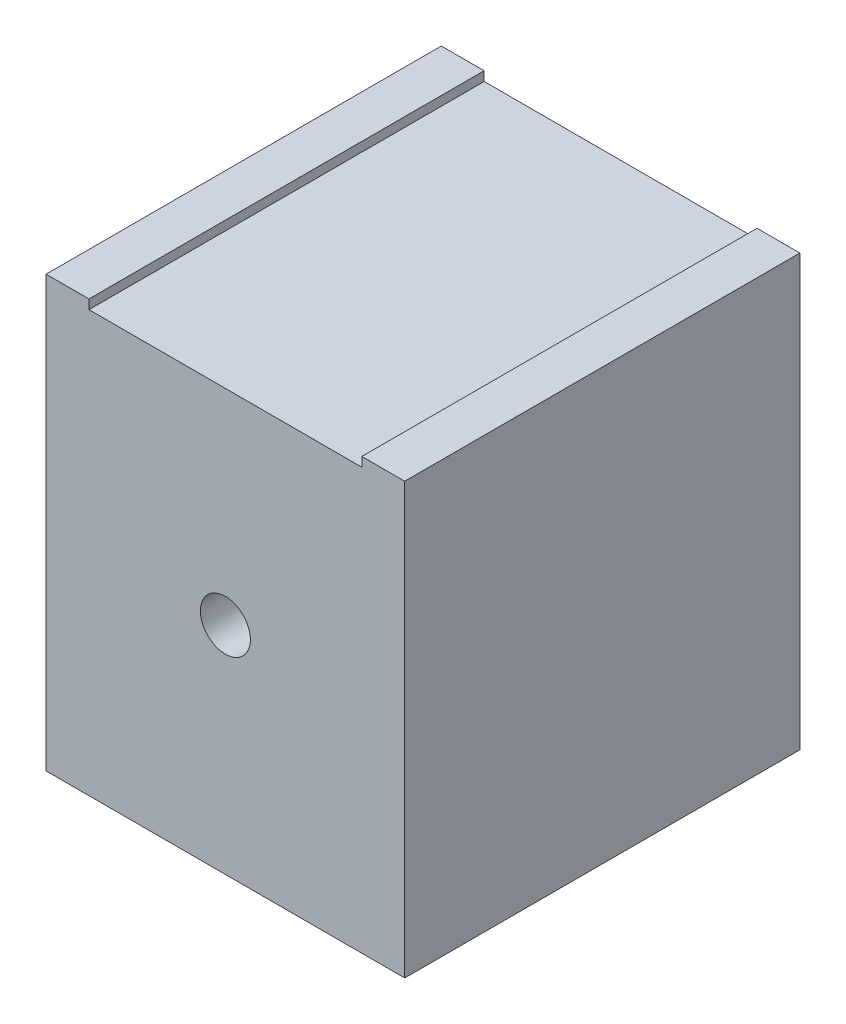
ISO-10303-21;
HEADER;
FILE_DESCRIPTION(('STEP AP214'),'2;1');
FILE_NAME('part.step','',(''),(''),'','','');
FILE_SCHEMA(('AUTOMOTIVE_DESIGN { 1 0 10303 214 1 1 1 1 }'));
ENDSEC;
DATA;
#1=APPLICATION_CONTEXT('core data for automotive mechanical design processes');
#2=APPLICATION_PROTOCOL_DEFINITION('international standard','automotive_design',2000,#1);
#3=PRODUCT_CONTEXT('',#1,'mechanical');
#4=PRODUCT('Part','Part','',(#3));
#5=PRODUCT_RELATED_PRODUCT_CATEGORY('part','',(#4));
#6=PRODUCT_DEFINITION_FORMATION('','',#4);
#7=PRODUCT_DEFINITION_CONTEXT('part definition',#1,'design');
#8=PRODUCT_DEFINITION('design','',#6,#7);
#9=PRODUCT_DEFINITION_SHAPE('','',#8);
#10=(LENGTH_UNIT() NAMED_UNIT(*) SI_UNIT(.MILLI.,.METRE.));
#11=(NAMED_UNIT(*) PLANE_ANGLE_UNIT() SI_UNIT($,.RADIAN.));
#12=(NAMED_UNIT(*) SI_UNIT($,.STERADIAN.) SOLID_ANGLE_UNIT());
#13=UNCERTAINTY_MEASURE_WITH_UNIT(LENGTH_MEASURE(1.E-05),#10,'distance_accuracy_value','');
#14=(GEOMETRIC_REPRESENTATION_CONTEXT(3) GLOBAL_UNCERTAINTY_ASSIGNED_CONTEXT((#13)) GLOBAL_UNIT_ASSIGNED_CONTEXT((#10,
#11,#12)) REPRESENTATION_CONTEXT('',''));
#15=CARTESIAN_POINT('',(0.,0.,0.));
#16=DIRECTION('',(0.,0.,1.));
#17=DIRECTION('',(1.,0.,0.));
#18=AXIS2_PLACEMENT_3D('',#15,#16,#17);
#19=CARTESIAN_POINT('',(0.,60.2,55.3));
#20=DIRECTION('',(0.,-1.,0.));
#21=DIRECTION('',(0.,0.,-1.));
#22=AXIS2_PLACEMENT_3D('',#19,#20,#21);
#23=PLANE('',#22);
#24=DIRECTION('',(-1.,0.,0.));
#25=VECTOR('',#24,1.);
#26=CARTESIAN_POINT('',(0.,60.2,55.3));
#27=LINE('',#26,#25);
#28=CARTESIAN_POINT('',(6.00000000000001,60.2,55.3));
#29=VERTEX_POINT('',#28);
#30=CARTESIAN_POINT('',(0.,60.2,55.3));
#31=VERTEX_POINT('',#30);
#32=EDGE_CURVE('E66',#29,#31,#27,.T.);
#33=ORIENTED_EDGE('',*,*,#32,.F.);
#34=DIRECTION('',(0.,0.,1.));
#35=VECTOR('',#34,1.);
#36=CARTESIAN_POINT('',(6.,60.2,0.));
#37=LINE('',#36,#35);
#38=CARTESIAN_POINT('',(6.,60.2,0.));
#39=VERTEX_POINT('',#38);
#40=EDGE_CURVE('E130',#39,#29,#37,.T.);
#41=ORIENTED_EDGE('',*,*,#40,.F.);
#42=DIRECTION('',(-1.,0.,0.));
#43=VECTOR('',#42,1.);
#44=CARTESIAN_POINT('',(0.,60.2,0.));
#45=LINE('',#44,#43);
#46=CARTESIAN_POINT('',(0.,60.2,0.));
#47=VERTEX_POINT('',#46);
#48=EDGE_CURVE('E88',#39,#47,#45,.T.);
#49=ORIENTED_EDGE('',*,*,#48,.T.);
#50=DIRECTION('',(0.,0.,-1.));
#51=VECTOR('',#50,1.);
#52=CARTESIAN_POINT('',(0.,60.2,55.3));
#53=LINE('',#52,#51);
#54=EDGE_CURVE('E181',#31,#47,#53,.T.);
#55=ORIENTED_EDGE('',*,*,#54,.F.);
#56=EDGE_LOOP('',(#33,#41,#49,#55));
#57=FACE_BOUND('',#56,.T.);
#58=ADVANCED_FACE('F41',(#57),#23,.F.);
#59=CARTESIAN_POINT('',(0.,0.,55.3));
#60=DIRECTION('',(1.,0.,0.));
#61=DIRECTION('',(0.,0.,-1.));
#62=AXIS2_PLACEMENT_3D('',#59,#60,#61);
#63=PLANE('',#62);
#64=DIRECTION('',(0.,-1.,0.));
#65=VECTOR('',#64,1.);
#66=CARTESIAN_POINT('',(0.,0.,0.));
#67=LINE('',#66,#65);
#68=CARTESIAN_POINT('',(0.,0.,0.));
#69=VERTEX_POINT('',#68);
#70=EDGE_CURVE('E158',#47,#69,#67,.T.);
#71=ORIENTED_EDGE('',*,*,#70,.T.);
#72=DIRECTION('',(0.,0.,-1.));
#73=VECTOR('',#72,1.);
#74=CARTESIAN_POINT('',(0.,0.,55.3));
#75=LINE('',#74,#73);
#76=CARTESIAN_POINT('',(0.,0.,55.3));
#77=VERTEX_POINT('',#76);
#78=EDGE_CURVE('E11',#77,#69,#75,.T.);
#79=ORIENTED_EDGE('',*,*,#78,.F.);
#80=DIRECTION('',(0.,-1.,0.));
#81=VECTOR('',#80,1.);
#82=CARTESIAN_POINT('',(0.,0.,55.3));
#83=LINE('',#82,#81);
#84=EDGE_CURVE('E168',#31,#77,#83,.T.);
#85=ORIENTED_EDGE('',*,*,#84,.F.);
#86=ORIENTED_EDGE('',*,*,#54,.T.);
#87=EDGE_LOOP('',(#71,#79,#85,#86));
#88=FACE_BOUND('',#87,.T.);
#89=ADVANCED_FACE('F43',(#88),#63,.F.);
#90=CARTESIAN_POINT('',(0.,0.,55.3));
#91=DIRECTION('',(0.,1.,0.));
#92=DIRECTION('',(0.,0.,1.));
#93=AXIS2_PLACEMENT_3D('',#90,#91,#92);
#94=PLANE('',#93);
#95=DIRECTION('',(1.,0.,0.));
#96=VECTOR('',#95,1.);
#97=CARTESIAN_POINT('',(0.,0.,0.));
#98=LINE('',#97,#96);
#99=CARTESIAN_POINT('',(50.18,0.,0.));
#100=VERTEX_POINT('',#99);
#101=EDGE_CURVE('E185',#69,#100,#98,.T.);
#102=ORIENTED_EDGE('',*,*,#101,.T.);
#103=DIRECTION('',(0.,0.,-1.));
#104=VECTOR('',#103,1.);
#105=CARTESIAN_POINT('',(50.18,0.,55.3));
#106=LINE('',#105,#104);
#107=CARTESIAN_POINT('',(50.18,0.,55.3));
#108=VERTEX_POINT('',#107);
#109=EDGE_CURVE('E50',#108,#100,#106,.T.);
#110=ORIENTED_EDGE('',*,*,#109,.F.);
#111=DIRECTION('',(1.,0.,0.));
#112=VECTOR('',#111,1.);
#113=CARTESIAN_POINT('',(0.,0.,55.3));
#114=LINE('',#113,#112);
#115=EDGE_CURVE('E95',#77,#108,#114,.T.);
#116=ORIENTED_EDGE('',*,*,#115,.F.);
#117=ORIENTED_EDGE('',*,*,#78,.T.);
#118=EDGE_LOOP('',(#102,#110,#116,#117));
#119=FACE_BOUND('',#118,.T.);
#120=ADVANCED_FACE('F222',(#119),#94,.F.);
#121=CARTESIAN_POINT('',(50.18,0.,55.3));
#122=DIRECTION('',(-1.,0.,0.));
#123=DIRECTION('',(0.,0.,1.));
#124=AXIS2_PLACEMENT_3D('',#121,#122,#123);
#125=PLANE('',#124);
#126=DIRECTION('',(0.,1.,0.));
#127=VECTOR('',#126,1.);
#128=CARTESIAN_POINT('',(50.18,0.,0.));
#129=LINE('',#128,#127);
#130=CARTESIAN_POINT('',(50.18,60.2,0.));
#131=VERTEX_POINT('',#130);
#132=EDGE_CURVE('E188',#100,#131,#129,.T.);
#133=ORIENTED_EDGE('',*,*,#132,.T.);
#134=DIRECTION('',(0.,0.,-1.));
#135=VECTOR('',#134,1.);
#136=CARTESIAN_POINT('',(50.18,60.2,55.3));
#137=LINE('',#136,#135);
#138=CARTESIAN_POINT('',(50.18,60.2,55.3));
#139=VERTEX_POINT('',#138);
#140=EDGE_CURVE('E196',#139,#131,#137,.T.);
#141=ORIENTED_EDGE('',*,*,#140,.F.);
#142=DIRECTION('',(0.,1.,0.));
#143=VECTOR('',#142,1.);
#144=CARTESIAN_POINT('',(50.18,0.,55.3));
#145=LINE('',#144,#143);
#146=EDGE_CURVE('E174',#108,#139,#145,.T.);
#147=ORIENTED_EDGE('',*,*,#146,.F.);
#148=ORIENTED_EDGE('',*,*,#109,.T.);
#149=EDGE_LOOP('',(#133,#141,#147,#148));
#150=FACE_BOUND('',#149,.T.);
#151=ADVANCED_FACE('F204',(#150),#125,.F.);
#152=CARTESIAN_POINT('',(44.18,60.2,0.));
#153=VERTEX_POINT('',#152);
#154=EDGE_CURVE('E171',#131,#153,#45,.T.);
#155=ORIENTED_EDGE('',*,*,#154,.T.);
#156=DIRECTION('',(0.,0.,-1.));
#157=VECTOR('',#156,1.);
#158=CARTESIAN_POINT('',(44.18,60.2,0.));
#159=LINE('',#158,#157);
#160=CARTESIAN_POINT('',(44.18,60.2,55.3));
#161=VERTEX_POINT('',#160);
#162=EDGE_CURVE('E135',#161,#153,#159,.T.);
#163=ORIENTED_EDGE('',*,*,#162,.F.);
#164=EDGE_CURVE('E177',#139,#161,#27,.T.);
#165=ORIENTED_EDGE('',*,*,#164,.F.);
#166=ORIENTED_EDGE('',*,*,#140,.T.);
#167=EDGE_LOOP('',(#155,#163,#165,#166));
#168=FACE_BOUND('',#167,.T.);
#169=ADVANCED_FACE('F214',(#168),#23,.F.);
#170=CARTESIAN_POINT('',(0.,0.,55.3));
#171=DIRECTION('',(0.,0.,-1.));
#172=DIRECTION('',(-1.,0.,0.));
#173=AXIS2_PLACEMENT_3D('',#170,#171,#172);
#174=PLANE('',#173);
#175=CARTESIAN_POINT('',(25.09,30.2,55.3));
#176=DIRECTION('',(0.,0.,1.));
#177=DIRECTION('',(1.,0.,0.));
#178=AXIS2_PLACEMENT_3D('',#175,#176,#177);
#179=CIRCLE('',#178,3.5);
#180=CARTESIAN_POINT('',(28.59,30.2,55.3));
#181=VERTEX_POINT('',#180);
#182=EDGE_CURVE('E131',#181,#181,#179,.T.);
#183=ORIENTED_EDGE('',*,*,#182,.F.);
#184=EDGE_LOOP('',(#183));
#185=FACE_BOUND('',#184,.T.);
#186=DIRECTION('',(1.,0.,0.));
#187=VECTOR('',#186,1.);
#188=CARTESIAN_POINT('',(6.00000000000001,58.9,55.3));
#189=LINE('',#188,#187);
#190=CARTESIAN_POINT('',(6.00000000000001,58.9,55.3));
#191=VERTEX_POINT('',#190);
#192=CARTESIAN_POINT('',(44.18,58.9,55.3));
#193=VERTEX_POINT('',#192);
#194=EDGE_CURVE('E144',#191,#193,#189,.T.);
#195=ORIENTED_EDGE('',*,*,#194,.F.);
#196=DIRECTION('',(0.,1.,0.));
#197=VECTOR('',#196,1.);
#198=CARTESIAN_POINT('',(6.00000000000001,58.9,55.3));
#199=LINE('',#198,#197);
#200=EDGE_CURVE('E151',#191,#29,#199,.T.);
#201=ORIENTED_EDGE('',*,*,#200,.T.);
#202=ORIENTED_EDGE('',*,*,#32,.T.);
#203=ORIENTED_EDGE('',*,*,#84,.T.);
#204=ORIENTED_EDGE('',*,*,#115,.T.);
#205=ORIENTED_EDGE('',*,*,#146,.T.);
#206=ORIENTED_EDGE('',*,*,#164,.T.);
#207=DIRECTION('',(0.,1.,0.));
#208=VECTOR('',#207,1.);
#209=CARTESIAN_POINT('',(44.18,58.9,55.3));
#210=LINE('',#209,#208);
#211=EDGE_CURVE('E163',#193,#161,#210,.T.);
#212=ORIENTED_EDGE('',*,*,#211,.F.);
#213=EDGE_LOOP('',(#195,#201,#202,#203,#204,#205,#206,#212));
#214=FACE_BOUND('',#213,.T.);
#215=ADVANCED_FACE('F218',(#185,#214),#174,.F.);
#216=CARTESIAN_POINT('',(0.,0.,0.));
#217=DIRECTION('',(0.,0.,-1.));
#218=DIRECTION('',(-1.,0.,0.));
#219=AXIS2_PLACEMENT_3D('',#216,#217,#218);
#220=PLANE('',#219);
#221=DIRECTION('',(0.,1.,0.));
#222=VECTOR('',#221,1.);
#223=CARTESIAN_POINT('',(6.,58.9,0.));
#224=LINE('',#223,#222);
#225=CARTESIAN_POINT('',(6.,58.9,0.));
#226=VERTEX_POINT('',#225);
#227=EDGE_CURVE('E155',#226,#39,#224,.T.);
#228=ORIENTED_EDGE('',*,*,#227,.F.);
#229=DIRECTION('',(-1.,0.,0.));
#230=VECTOR('',#229,1.);
#231=CARTESIAN_POINT('',(6.,58.9,0.));
#232=LINE('',#231,#230);
#233=CARTESIAN_POINT('',(44.18,58.9,0.));
#234=VERTEX_POINT('',#233);
#235=EDGE_CURVE('E149',#234,#226,#232,.T.);
#236=ORIENTED_EDGE('',*,*,#235,.F.);
#237=DIRECTION('',(0.,1.,0.));
#238=VECTOR('',#237,1.);
#239=CARTESIAN_POINT('',(44.18,58.9,0.));
#240=LINE('',#239,#238);
#241=EDGE_CURVE('E159',#234,#153,#240,.T.);
#242=ORIENTED_EDGE('',*,*,#241,.T.);
#243=ORIENTED_EDGE('',*,*,#154,.F.);
#244=ORIENTED_EDGE('',*,*,#132,.F.);
#245=ORIENTED_EDGE('',*,*,#101,.F.);
#246=ORIENTED_EDGE('',*,*,#70,.F.);
#247=ORIENTED_EDGE('',*,*,#48,.F.);
#248=EDGE_LOOP('',(#228,#236,#242,#243,#244,#245,#246,#247));
#249=FACE_BOUND('',#248,.T.);
#250=ADVANCED_FACE('F209',(#249),#220,.T.);
#251=CARTESIAN_POINT('',(6.,58.9,0.));
#252=DIRECTION('',(-1.,0.,0.));
#253=DIRECTION('',(0.,0.,1.));
#254=AXIS2_PLACEMENT_3D('',#251,#252,#253);
#255=PLANE('',#254);
#256=ORIENTED_EDGE('',*,*,#40,.T.);
#257=ORIENTED_EDGE('',*,*,#200,.F.);
#258=DIRECTION('',(0.,0.,1.));
#259=VECTOR('',#258,1.);
#260=CARTESIAN_POINT('',(6.,58.9,0.));
#261=LINE('',#260,#259);
#262=EDGE_CURVE('E140',#226,#191,#261,.T.);
#263=ORIENTED_EDGE('',*,*,#262,.F.);
#264=ORIENTED_EDGE('',*,*,#227,.T.);
#265=EDGE_LOOP('',(#256,#257,#263,#264));
#266=FACE_BOUND('',#265,.T.);
#267=ADVANCED_FACE('F243',(#266),#255,.F.);
#268=CARTESIAN_POINT('',(44.18,58.9,0.));
#269=DIRECTION('',(1.,0.,0.));
#270=DIRECTION('',(0.,0.,-1.));
#271=AXIS2_PLACEMENT_3D('',#268,#269,#270);
#272=PLANE('',#271);
#273=ORIENTED_EDGE('',*,*,#162,.T.);
#274=ORIENTED_EDGE('',*,*,#241,.F.);
#275=DIRECTION('',(0.,0.,-1.));
#276=VECTOR('',#275,1.);
#277=CARTESIAN_POINT('',(44.18,58.9,0.));
#278=LINE('',#277,#276);
#279=EDGE_CURVE('E57',#193,#234,#278,.T.);
#280=ORIENTED_EDGE('',*,*,#279,.F.);
#281=ORIENTED_EDGE('',*,*,#211,.T.);
#282=EDGE_LOOP('',(#273,#274,#280,#281));
#283=FACE_BOUND('',#282,.T.);
#284=ADVANCED_FACE('F248',(#283),#272,.F.);
#285=CARTESIAN_POINT('',(0.,58.9,0.));
#286=DIRECTION('',(0.,1.,0.));
#287=DIRECTION('',(0.,0.,1.));
#288=AXIS2_PLACEMENT_3D('',#285,#286,#287);
#289=PLANE('',#288);
#290=ORIENTED_EDGE('',*,*,#262,.T.);
#291=ORIENTED_EDGE('',*,*,#194,.T.);
#292=ORIENTED_EDGE('',*,*,#279,.T.);
#293=ORIENTED_EDGE('',*,*,#235,.T.);
#294=EDGE_LOOP('',(#290,#291,#292,#293));
#295=FACE_BOUND('',#294,.T.);
#296=ADVANCED_FACE('F123',(#295),#289,.T.);
#297=CARTESIAN_POINT('',(25.09,30.2,45.3));
#298=DIRECTION('',(0.,0.,1.));
#299=DIRECTION('',(1.,0.,0.));
#300=AXIS2_PLACEMENT_3D('',#297,#298,#299);
#301=CONICAL_SURFACE('',#300,3.5,1.02974425867665);
#302=CARTESIAN_POINT('',(25.09,30.2,43.1969878334035));
#303=VERTEX_POINT('',#302);
#304=VERTEX_LOOP('',#303);
#305=FACE_BOUND('',#304,.T.);
#306=CARTESIAN_POINT('',(25.09,30.2,45.3));
#307=DIRECTION('',(0.,0.,1.));
#308=DIRECTION('',(1.,0.,0.));
#309=AXIS2_PLACEMENT_3D('',#306,#307,#308);
#310=CIRCLE('',#309,3.5);
#311=CARTESIAN_POINT('',(28.59,30.2,45.3));
#312=VERTEX_POINT('',#311);
#313=EDGE_CURVE('E127',#312,#312,#310,.T.);
#314=ORIENTED_EDGE('',*,*,#313,.T.);
#315=EDGE_LOOP('',(#314));
#316=FACE_BOUND('',#315,.T.);
#317=ADVANCED_FACE('F119',(#305,#316),#301,.F.);
#318=CARTESIAN_POINT('',(25.09,30.2,55.3));
#319=DIRECTION('',(0.,0.,1.));
#320=DIRECTION('',(1.,0.,0.));
#321=AXIS2_PLACEMENT_3D('',#318,#319,#320);
#322=CYLINDRICAL_SURFACE('',#321,3.5);
#323=ORIENTED_EDGE('',*,*,#313,.F.);
#324=EDGE_LOOP('',(#323));
#325=FACE_BOUND('',#324,.T.);
#326=ORIENTED_EDGE('',*,*,#182,.T.);
#327=EDGE_LOOP('',(#326));
#328=FACE_BOUND('',#327,.T.);
#329=ADVANCED_FACE('F122',(#325,#328),#322,.F.);
#330=CLOSED_SHELL('',(#58,#89,#120,#151,#169,#215,#250,#267,#284,#296,#317,#329));
#331=MANIFOLD_SOLID_BREP('B2',#330);
#332=ADVANCED_BREP_SHAPE_REPRESENTATION('',(#18,#331),#14);
#333=SHAPE_DEFINITION_REPRESENTATION(#9,#332);
ENDSEC;
END-ISO-10303-21;
